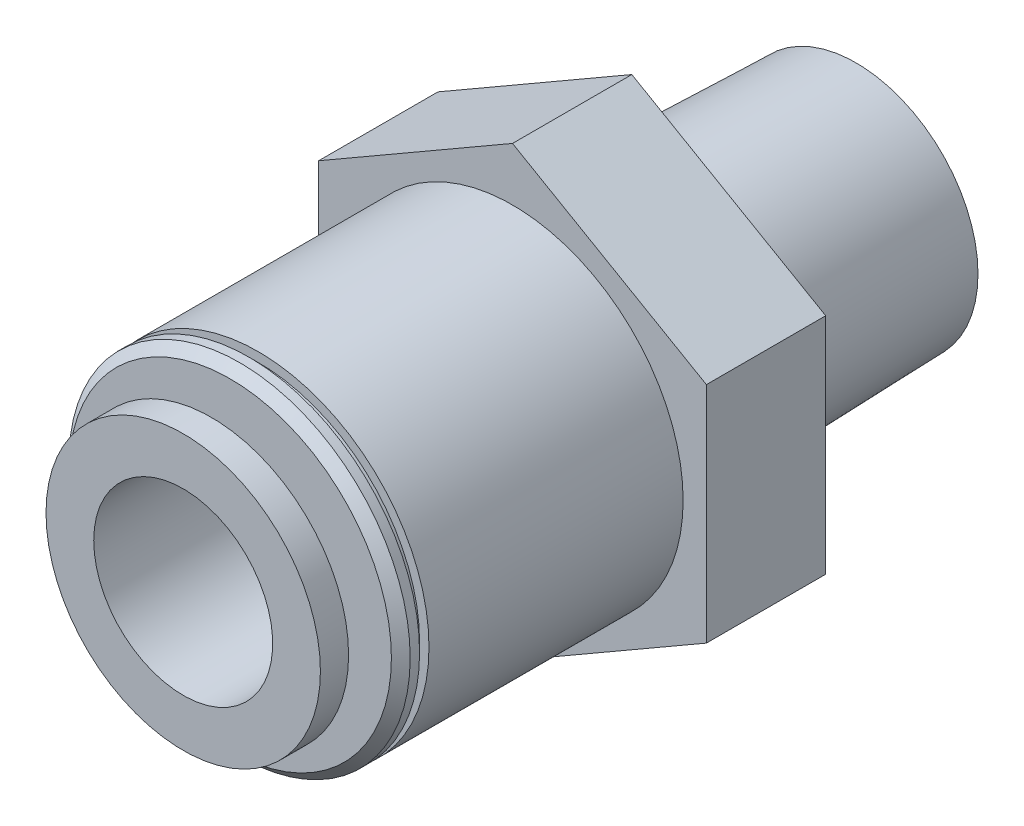
ISO-10303-21;
HEADER;
FILE_DESCRIPTION(('STEP AP214'),'2;1');
FILE_NAME('part.step','',(''),(''),'','','');
FILE_SCHEMA(('AUTOMOTIVE_DESIGN { 1 0 10303 214 1 1 1 1 }'));
ENDSEC;
DATA;
#1=APPLICATION_CONTEXT('core data for automotive mechanical design processes');
#2=APPLICATION_PROTOCOL_DEFINITION('international standard','automotive_design',2000,#1);
#3=PRODUCT_CONTEXT('',#1,'mechanical');
#4=PRODUCT('Part','Part','',(#3));
#5=PRODUCT_RELATED_PRODUCT_CATEGORY('part','',(#4));
#6=PRODUCT_DEFINITION_FORMATION('','',#4);
#7=PRODUCT_DEFINITION_CONTEXT('part definition',#1,'design');
#8=PRODUCT_DEFINITION('design','',#6,#7);
#9=PRODUCT_DEFINITION_SHAPE('','',#8);
#10=(LENGTH_UNIT() NAMED_UNIT(*) SI_UNIT(.MILLI.,.METRE.));
#11=(NAMED_UNIT(*) PLANE_ANGLE_UNIT() SI_UNIT($,.RADIAN.));
#12=(NAMED_UNIT(*) SI_UNIT($,.STERADIAN.) SOLID_ANGLE_UNIT());
#13=UNCERTAINTY_MEASURE_WITH_UNIT(LENGTH_MEASURE(1.E-05),#10,'distance_accuracy_value','');
#14=(GEOMETRIC_REPRESENTATION_CONTEXT(3) GLOBAL_UNCERTAINTY_ASSIGNED_CONTEXT((#13)) GLOBAL_UNIT_ASSIGNED_CONTEXT((#10,
#11,#12)) REPRESENTATION_CONTEXT('',''));
#15=CARTESIAN_POINT('',(0.,0.,0.));
#16=DIRECTION('',(0.,0.,1.));
#17=DIRECTION('',(1.,0.,0.));
#18=AXIS2_PLACEMENT_3D('',#15,#16,#17);
#19=CARTESIAN_POINT('',(0.,11.9150661804009,0.));
#20=DIRECTION('',(0.,0.,-1.));
#21=DIRECTION('',(-1.,0.,0.));
#22=AXIS2_PLACEMENT_3D('',#19,#20,#21);
#23=PLANE('',#22);
#24=DIRECTION('',(0.866025403784439,0.5,0.));
#25=VECTOR('',#24,1.);
#26=CARTESIAN_POINT('',(-10.31875,5.95753309020045,0.));
#27=LINE('',#26,#25);
#28=CARTESIAN_POINT('',(-10.31875,5.95753309020045,0.));
#29=VERTEX_POINT('',#28);
#30=CARTESIAN_POINT('',(0.,11.9150661804009,0.));
#31=VERTEX_POINT('',#30);
#32=EDGE_CURVE('E131',#29,#31,#27,.T.);
#33=ORIENTED_EDGE('',*,*,#32,.T.);
#34=DIRECTION('',(0.866025403784439,-0.5,0.));
#35=VECTOR('',#34,1.);
#36=CARTESIAN_POINT('',(0.,11.9150661804009,0.));
#37=LINE('',#36,#35);
#38=CARTESIAN_POINT('',(10.31875,5.95753309020045,0.));
#39=VERTEX_POINT('',#38);
#40=EDGE_CURVE('E89',#31,#39,#37,.T.);
#41=ORIENTED_EDGE('',*,*,#40,.T.);
#42=DIRECTION('',(0.,-1.,0.));
#43=VECTOR('',#42,1.);
#44=CARTESIAN_POINT('',(10.31875,5.95753309020045,0.));
#45=LINE('',#44,#43);
#46=CARTESIAN_POINT('',(10.31875,-5.95753309020045,0.));
#47=VERTEX_POINT('',#46);
#48=EDGE_CURVE('E102',#39,#47,#45,.T.);
#49=ORIENTED_EDGE('',*,*,#48,.T.);
#50=DIRECTION('',(-0.866025403784439,-0.5,0.));
#51=VECTOR('',#50,1.);
#52=CARTESIAN_POINT('',(10.31875,-5.95753309020045,0.));
#53=LINE('',#52,#51);
#54=CARTESIAN_POINT('',(0.,-11.9150661804009,0.));
#55=VERTEX_POINT('',#54);
#56=EDGE_CURVE('E96',#47,#55,#53,.T.);
#57=ORIENTED_EDGE('',*,*,#56,.T.);
#58=DIRECTION('',(-0.866025403784439,0.5,0.));
#59=VECTOR('',#58,1.);
#60=CARTESIAN_POINT('',(0.,-11.9150661804009,0.));
#61=LINE('',#60,#59);
#62=CARTESIAN_POINT('',(-10.31875,-5.95753309020045,0.));
#63=VERTEX_POINT('',#62);
#64=EDGE_CURVE('E100',#55,#63,#61,.T.);
#65=ORIENTED_EDGE('',*,*,#64,.T.);
#66=DIRECTION('',(0.,1.,0.));
#67=VECTOR('',#66,1.);
#68=CARTESIAN_POINT('',(-10.31875,-5.95753309020045,0.));
#69=LINE('',#68,#67);
#70=EDGE_CURVE('E51',#63,#29,#69,.T.);
#71=ORIENTED_EDGE('',*,*,#70,.T.);
#72=EDGE_LOOP('',(#33,#41,#49,#57,#65,#71));
#73=FACE_BOUND('',#72,.T.);
#74=CARTESIAN_POINT('',(0.,0.,0.));
#75=DIRECTION('',(0.,0.,-1.));
#76=DIRECTION('',(-1.,0.,0.));
#77=AXIS2_PLACEMENT_3D('',#74,#75,#76);
#78=CIRCLE('',#77,6.858);
#79=CARTESIAN_POINT('',(-6.858,0.,0.));
#80=VERTEX_POINT('',#79);
#81=EDGE_CURVE('E259',#80,#80,#78,.T.);
#82=ORIENTED_EDGE('',*,*,#81,.F.);
#83=EDGE_LOOP('',(#82));
#84=FACE_BOUND('',#83,.T.);
#85=ADVANCED_FACE('F34',(#73,#84),#23,.T.);
#86=CARTESIAN_POINT('',(0.,7.3025,23.876));
#87=DIRECTION('',(0.,0.,-1.));
#88=DIRECTION('',(-1.,0.,0.));
#89=AXIS2_PLACEMENT_3D('',#86,#87,#88);
#90=PLANE('',#89);
#91=CARTESIAN_POINT('',(0.,0.,23.876));
#92=DIRECTION('',(0.,0.,-1.));
#93=DIRECTION('',(-1.,0.,0.));
#94=AXIS2_PLACEMENT_3D('',#91,#92,#93);
#95=CIRCLE('',#94,4.7625);
#96=CARTESIAN_POINT('',(-4.7625,0.,23.876));
#97=VERTEX_POINT('',#96);
#98=EDGE_CURVE('E256',#97,#97,#95,.T.);
#99=ORIENTED_EDGE('',*,*,#98,.T.);
#100=EDGE_LOOP('',(#99));
#101=FACE_BOUND('',#100,.T.);
#102=CARTESIAN_POINT('',(0.,0.,23.876));
#103=DIRECTION('',(0.,0.,1.));
#104=DIRECTION('',(1.,0.,0.));
#105=AXIS2_PLACEMENT_3D('',#102,#103,#104);
#106=CIRCLE('',#105,7.3025);
#107=CARTESIAN_POINT('',(7.3025,0.,23.876));
#108=VERTEX_POINT('',#107);
#109=EDGE_CURVE('E143',#108,#108,#106,.T.);
#110=ORIENTED_EDGE('',*,*,#109,.T.);
#111=EDGE_LOOP('',(#110));
#112=FACE_BOUND('',#111,.T.);
#113=ADVANCED_FACE('F36',(#101,#112),#90,.F.);
#114=CARTESIAN_POINT('',(0.,0.,23.876));
#115=DIRECTION('',(0.,0.,1.));
#116=DIRECTION('',(1.,0.,0.));
#117=AXIS2_PLACEMENT_3D('',#114,#115,#116);
#118=CYLINDRICAL_SURFACE('',#117,9.0805);
#119=CARTESIAN_POINT('',(0.,0.,19.876));
#120=DIRECTION('',(0.,0.,1.));
#121=DIRECTION('',(1.,0.,0.));
#122=AXIS2_PLACEMENT_3D('',#119,#120,#121);
#123=CIRCLE('',#122,9.0805);
#124=CARTESIAN_POINT('',(9.0805,0.,19.876));
#125=VERTEX_POINT('',#124);
#126=EDGE_CURVE('E11',#125,#125,#123,.T.);
#127=ORIENTED_EDGE('',*,*,#126,.F.);
#128=EDGE_LOOP('',(#127));
#129=FACE_BOUND('',#128,.T.);
#130=CARTESIAN_POINT('',(0.,0.,6.35));
#131=DIRECTION('',(0.,0.,-1.));
#132=DIRECTION('',(-1.,0.,0.));
#133=AXIS2_PLACEMENT_3D('',#130,#131,#132);
#134=CIRCLE('',#133,9.0805);
#135=CARTESIAN_POINT('',(-9.0805,0.,6.35));
#136=VERTEX_POINT('',#135);
#137=EDGE_CURVE('E140',#136,#136,#134,.T.);
#138=ORIENTED_EDGE('',*,*,#137,.F.);
#139=EDGE_LOOP('',(#138));
#140=FACE_BOUND('',#139,.T.);
#141=ADVANCED_FACE('F174',(#129,#140),#118,.T.);
#142=CARTESIAN_POINT('',(0.,8.5805,19.876));
#143=DIRECTION('',(0.,0.,-1.));
#144=DIRECTION('',(-1.,0.,0.));
#145=AXIS2_PLACEMENT_3D('',#142,#143,#144);
#146=PLANE('',#145);
#147=CARTESIAN_POINT('',(0.,0.,19.876));
#148=DIRECTION('',(0.,0.,1.));
#149=DIRECTION('',(1.,0.,0.));
#150=AXIS2_PLACEMENT_3D('',#147,#148,#149);
#151=CIRCLE('',#150,8.5805);
#152=CARTESIAN_POINT('',(8.5805,0.,19.876));
#153=VERTEX_POINT('',#152);
#154=EDGE_CURVE('E43',#153,#153,#151,.T.);
#155=ORIENTED_EDGE('',*,*,#154,.F.);
#156=EDGE_LOOP('',(#155));
#157=FACE_BOUND('',#156,.T.);
#158=ORIENTED_EDGE('',*,*,#126,.T.);
#159=EDGE_LOOP('',(#158));
#160=FACE_BOUND('',#159,.T.);
#161=ADVANCED_FACE('F171',(#157,#160),#146,.F.);
#162=CARTESIAN_POINT('',(0.,0.,23.876));
#163=DIRECTION('',(0.,0.,1.));
#164=DIRECTION('',(1.,0.,0.));
#165=AXIS2_PLACEMENT_3D('',#162,#163,#164);
#166=CYLINDRICAL_SURFACE('',#165,8.5805);
#167=CARTESIAN_POINT('',(0.,0.,20.376));
#168=DIRECTION('',(0.,0.,1.));
#169=DIRECTION('',(1.,0.,0.));
#170=AXIS2_PLACEMENT_3D('',#167,#168,#169);
#171=CIRCLE('',#170,8.5805);
#172=CARTESIAN_POINT('',(8.5805,0.,20.376));
#173=VERTEX_POINT('',#172);
#174=EDGE_CURVE('E164',#173,#173,#171,.T.);
#175=ORIENTED_EDGE('',*,*,#174,.F.);
#176=EDGE_LOOP('',(#175));
#177=FACE_BOUND('',#176,.T.);
#178=ORIENTED_EDGE('',*,*,#154,.T.);
#179=EDGE_LOOP('',(#178));
#180=FACE_BOUND('',#179,.T.);
#181=ADVANCED_FACE('F169',(#177,#180),#166,.T.);
#182=CARTESIAN_POINT('',(0.,9.0805,20.376));
#183=DIRECTION('',(0.,0.,1.));
#184=DIRECTION('',(1.,0.,0.));
#185=AXIS2_PLACEMENT_3D('',#182,#183,#184);
#186=PLANE('',#185);
#187=CARTESIAN_POINT('',(0.,0.,20.376));
#188=DIRECTION('',(0.,0.,1.));
#189=DIRECTION('',(1.,0.,0.));
#190=AXIS2_PLACEMENT_3D('',#187,#188,#189);
#191=CIRCLE('',#190,9.0805);
#192=CARTESIAN_POINT('',(9.0805,0.,20.376));
#193=VERTEX_POINT('',#192);
#194=EDGE_CURVE('E161',#193,#193,#191,.T.);
#195=ORIENTED_EDGE('',*,*,#194,.F.);
#196=EDGE_LOOP('',(#195));
#197=FACE_BOUND('',#196,.T.);
#198=ORIENTED_EDGE('',*,*,#174,.T.);
#199=EDGE_LOOP('',(#198));
#200=FACE_BOUND('',#199,.T.);
#201=ADVANCED_FACE('F300',(#197,#200),#186,.F.);
#202=CARTESIAN_POINT('',(0.,0.,23.876));
#203=DIRECTION('',(0.,0.,1.));
#204=DIRECTION('',(1.,0.,0.));
#205=AXIS2_PLACEMENT_3D('',#202,#203,#204);
#206=CYLINDRICAL_SURFACE('',#205,9.0805);
#207=CARTESIAN_POINT('',(0.,0.,20.876));
#208=DIRECTION('',(0.,0.,1.));
#209=DIRECTION('',(1.,0.,0.));
#210=AXIS2_PLACEMENT_3D('',#207,#208,#209);
#211=CIRCLE('',#210,9.0805);
#212=CARTESIAN_POINT('',(9.0805,0.,20.876));
#213=VERTEX_POINT('',#212);
#214=EDGE_CURVE('E158',#213,#213,#211,.T.);
#215=ORIENTED_EDGE('',*,*,#214,.F.);
#216=EDGE_LOOP('',(#215));
#217=FACE_BOUND('',#216,.T.);
#218=ORIENTED_EDGE('',*,*,#194,.T.);
#219=EDGE_LOOP('',(#218));
#220=FACE_BOUND('',#219,.T.);
#221=ADVANCED_FACE('F296',(#217,#220),#206,.T.);
#222=CARTESIAN_POINT('',(0.,0.,20.876));
#223=DIRECTION('',(0.,0.,-1.));
#224=DIRECTION('',(-1.,0.,0.));
#225=AXIS2_PLACEMENT_3D('',#222,#223,#224);
#226=CONICAL_SURFACE('',#225,9.0805,0.785398163397452);
#227=CARTESIAN_POINT('',(0.,0.,21.376));
#228=DIRECTION('',(0.,0.,1.));
#229=DIRECTION('',(1.,0.,0.));
#230=AXIS2_PLACEMENT_3D('',#227,#228,#229);
#231=CIRCLE('',#230,8.5805);
#232=CARTESIAN_POINT('',(8.5805,0.,21.376));
#233=VERTEX_POINT('',#232);
#234=EDGE_CURVE('E155',#233,#233,#231,.T.);
#235=ORIENTED_EDGE('',*,*,#234,.F.);
#236=EDGE_LOOP('',(#235));
#237=FACE_BOUND('',#236,.T.);
#238=ORIENTED_EDGE('',*,*,#214,.T.);
#239=EDGE_LOOP('',(#238));
#240=FACE_BOUND('',#239,.T.);
#241=ADVANCED_FACE('F292',(#237,#240),#226,.T.);
#242=CARTESIAN_POINT('',(0.,8.5805,21.376));
#243=DIRECTION('',(0.,0.,-1.));
#244=DIRECTION('',(-1.,0.,0.));
#245=AXIS2_PLACEMENT_3D('',#242,#243,#244);
#246=PLANE('',#245);
#247=CARTESIAN_POINT('',(0.,0.,21.376));
#248=DIRECTION('',(0.,0.,1.));
#249=DIRECTION('',(1.,0.,0.));
#250=AXIS2_PLACEMENT_3D('',#247,#248,#249);
#251=CIRCLE('',#250,5.3975);
#252=CARTESIAN_POINT('',(5.3975,0.,21.376));
#253=VERTEX_POINT('',#252);
#254=EDGE_CURVE('E152',#253,#253,#251,.T.);
#255=ORIENTED_EDGE('',*,*,#254,.F.);
#256=EDGE_LOOP('',(#255));
#257=FACE_BOUND('',#256,.T.);
#258=ORIENTED_EDGE('',*,*,#234,.T.);
#259=EDGE_LOOP('',(#258));
#260=FACE_BOUND('',#259,.T.);
#261=ADVANCED_FACE('F288',(#257,#260),#246,.F.);
#262=CARTESIAN_POINT('',(0.,0.,23.876));
#263=DIRECTION('',(0.,0.,1.));
#264=DIRECTION('',(1.,0.,0.));
#265=AXIS2_PLACEMENT_3D('',#262,#263,#264);
#266=CYLINDRICAL_SURFACE('',#265,5.3975);
#267=CARTESIAN_POINT('',(0.,0.,22.376));
#268=DIRECTION('',(0.,0.,1.));
#269=DIRECTION('',(1.,0.,0.));
#270=AXIS2_PLACEMENT_3D('',#267,#268,#269);
#271=CIRCLE('',#270,5.3975);
#272=CARTESIAN_POINT('',(5.3975,0.,22.376));
#273=VERTEX_POINT('',#272);
#274=EDGE_CURVE('E149',#273,#273,#271,.T.);
#275=ORIENTED_EDGE('',*,*,#274,.F.);
#276=EDGE_LOOP('',(#275));
#277=FACE_BOUND('',#276,.T.);
#278=ORIENTED_EDGE('',*,*,#254,.T.);
#279=EDGE_LOOP('',(#278));
#280=FACE_BOUND('',#279,.T.);
#281=ADVANCED_FACE('F284',(#277,#280),#266,.T.);
#282=CARTESIAN_POINT('',(0.,5.3975,22.376));
#283=DIRECTION('',(0.,0.,1.));
#284=DIRECTION('',(1.,0.,0.));
#285=AXIS2_PLACEMENT_3D('',#282,#283,#284);
#286=PLANE('',#285);
#287=CARTESIAN_POINT('',(0.,0.,22.376));
#288=DIRECTION('',(0.,0.,1.));
#289=DIRECTION('',(1.,0.,0.));
#290=AXIS2_PLACEMENT_3D('',#287,#288,#289);
#291=CIRCLE('',#290,7.3025);
#292=CARTESIAN_POINT('',(7.3025,0.,22.376));
#293=VERTEX_POINT('',#292);
#294=EDGE_CURVE('E146',#293,#293,#291,.T.);
#295=ORIENTED_EDGE('',*,*,#294,.F.);
#296=EDGE_LOOP('',(#295));
#297=FACE_BOUND('',#296,.T.);
#298=ORIENTED_EDGE('',*,*,#274,.T.);
#299=EDGE_LOOP('',(#298));
#300=FACE_BOUND('',#299,.T.);
#301=ADVANCED_FACE('F195',(#297,#300),#286,.F.);
#302=CARTESIAN_POINT('',(0.,0.,23.876));
#303=DIRECTION('',(0.,0.,1.));
#304=DIRECTION('',(1.,0.,0.));
#305=AXIS2_PLACEMENT_3D('',#302,#303,#304);
#306=CYLINDRICAL_SURFACE('',#305,7.3025);
#307=ORIENTED_EDGE('',*,*,#109,.F.);
#308=EDGE_LOOP('',(#307));
#309=FACE_BOUND('',#308,.T.);
#310=ORIENTED_EDGE('',*,*,#294,.T.);
#311=EDGE_LOOP('',(#310));
#312=FACE_BOUND('',#311,.T.);
#313=ADVANCED_FACE('F185',(#309,#312),#306,.T.);
#314=CARTESIAN_POINT('',(0.,11.9150661804009,6.35));
#315=DIRECTION('',(0.,0.,-1.));
#316=DIRECTION('',(-1.,0.,0.));
#317=AXIS2_PLACEMENT_3D('',#314,#315,#316);
#318=PLANE('',#317);
#319=DIRECTION('',(0.866025403784439,0.5,0.));
#320=VECTOR('',#319,1.);
#321=CARTESIAN_POINT('',(-10.31875,5.95753309020045,6.35));
#322=LINE('',#321,#320);
#323=CARTESIAN_POINT('',(-10.31875,5.95753309020045,6.35));
#324=VERTEX_POINT('',#323);
#325=CARTESIAN_POINT('',(0.,11.9150661804009,6.35));
#326=VERTEX_POINT('',#325);
#327=EDGE_CURVE('E120',#324,#326,#322,.T.);
#328=ORIENTED_EDGE('',*,*,#327,.F.);
#329=DIRECTION('',(0.,1.,0.));
#330=VECTOR('',#329,1.);
#331=CARTESIAN_POINT('',(-10.31875,-5.95753309020045,6.35));
#332=LINE('',#331,#330);
#333=CARTESIAN_POINT('',(-10.31875,-5.95753309020045,6.35));
#334=VERTEX_POINT('',#333);
#335=EDGE_CURVE('E80',#334,#324,#332,.T.);
#336=ORIENTED_EDGE('',*,*,#335,.F.);
#337=DIRECTION('',(-0.866025403784439,0.5,0.));
#338=VECTOR('',#337,1.);
#339=CARTESIAN_POINT('',(0.,-11.9150661804009,6.35));
#340=LINE('',#339,#338);
#341=CARTESIAN_POINT('',(0.,-11.9150661804009,6.35));
#342=VERTEX_POINT('',#341);
#343=EDGE_CURVE('E74',#342,#334,#340,.T.);
#344=ORIENTED_EDGE('',*,*,#343,.F.);
#345=DIRECTION('',(-0.866025403784439,-0.5,0.));
#346=VECTOR('',#345,1.);
#347=CARTESIAN_POINT('',(10.31875,-5.95753309020045,6.35));
#348=LINE('',#347,#346);
#349=CARTESIAN_POINT('',(10.31875,-5.95753309020045,6.35));
#350=VERTEX_POINT('',#349);
#351=EDGE_CURVE('E110',#350,#342,#348,.T.);
#352=ORIENTED_EDGE('',*,*,#351,.F.);
#353=DIRECTION('',(0.,-1.,0.));
#354=VECTOR('',#353,1.);
#355=CARTESIAN_POINT('',(10.31875,5.95753309020045,6.35));
#356=LINE('',#355,#354);
#357=CARTESIAN_POINT('',(10.31875,5.95753309020045,6.35));
#358=VERTEX_POINT('',#357);
#359=EDGE_CURVE('E126',#358,#350,#356,.T.);
#360=ORIENTED_EDGE('',*,*,#359,.F.);
#361=DIRECTION('',(0.866025403784439,-0.5,0.));
#362=VECTOR('',#361,1.);
#363=CARTESIAN_POINT('',(0.,11.9150661804009,6.35));
#364=LINE('',#363,#362);
#365=EDGE_CURVE('E123',#326,#358,#364,.T.);
#366=ORIENTED_EDGE('',*,*,#365,.F.);
#367=EDGE_LOOP('',(#328,#336,#344,#352,#360,#366));
#368=FACE_BOUND('',#367,.T.);
#369=ORIENTED_EDGE('',*,*,#137,.T.);
#370=EDGE_LOOP('',(#369));
#371=FACE_BOUND('',#370,.T.);
#372=ADVANCED_FACE('F182',(#368,#371),#318,.F.);
#373=CARTESIAN_POINT('',(-10.31875,5.95753309020045,0.));
#374=DIRECTION('',(0.5,-0.866025403784439,0.));
#375=DIRECTION('',(0.866025403784439,0.5,0.));
#376=AXIS2_PLACEMENT_3D('',#373,#374,#375);
#377=PLANE('',#376);
#378=ORIENTED_EDGE('',*,*,#327,.T.);
#379=DIRECTION('',(0.,0.,1.));
#380=VECTOR('',#379,1.);
#381=CARTESIAN_POINT('',(0.,11.9150661804009,0.));
#382=LINE('',#381,#380);
#383=EDGE_CURVE('E138',#31,#326,#382,.T.);
#384=ORIENTED_EDGE('',*,*,#383,.F.);
#385=ORIENTED_EDGE('',*,*,#32,.F.);
#386=DIRECTION('',(0.,0.,1.));
#387=VECTOR('',#386,1.);
#388=CARTESIAN_POINT('',(-10.31875,5.95753309020045,0.));
#389=LINE('',#388,#387);
#390=EDGE_CURVE('E116',#29,#324,#389,.T.);
#391=ORIENTED_EDGE('',*,*,#390,.T.);
#392=EDGE_LOOP('',(#378,#384,#385,#391));
#393=FACE_BOUND('',#392,.T.);
#394=ADVANCED_FACE('F184',(#393),#377,.F.);
#395=CARTESIAN_POINT('',(0.,11.9150661804009,0.));
#396=DIRECTION('',(-0.5,-0.866025403784439,0.));
#397=DIRECTION('',(0.866025403784439,-0.5,0.));
#398=AXIS2_PLACEMENT_3D('',#395,#396,#397);
#399=PLANE('',#398);
#400=ORIENTED_EDGE('',*,*,#365,.T.);
#401=DIRECTION('',(0.,0.,1.));
#402=VECTOR('',#401,1.);
#403=CARTESIAN_POINT('',(10.31875,5.95753309020045,0.));
#404=LINE('',#403,#402);
#405=EDGE_CURVE('E135',#39,#358,#404,.T.);
#406=ORIENTED_EDGE('',*,*,#405,.F.);
#407=ORIENTED_EDGE('',*,*,#40,.F.);
#408=ORIENTED_EDGE('',*,*,#383,.T.);
#409=EDGE_LOOP('',(#400,#406,#407,#408));
#410=FACE_BOUND('',#409,.T.);
#411=ADVANCED_FACE('F192',(#410),#399,.F.);
#412=CARTESIAN_POINT('',(10.31875,5.95753309020045,0.));
#413=DIRECTION('',(-1.,0.,0.));
#414=DIRECTION('',(0.,0.,1.));
#415=AXIS2_PLACEMENT_3D('',#412,#413,#414);
#416=PLANE('',#415);
#417=ORIENTED_EDGE('',*,*,#359,.T.);
#418=DIRECTION('',(0.,0.,1.));
#419=VECTOR('',#418,1.);
#420=CARTESIAN_POINT('',(10.31875,-5.95753309020045,0.));
#421=LINE('',#420,#419);
#422=EDGE_CURVE('E111',#47,#350,#421,.T.);
#423=ORIENTED_EDGE('',*,*,#422,.F.);
#424=ORIENTED_EDGE('',*,*,#48,.F.);
#425=ORIENTED_EDGE('',*,*,#405,.T.);
#426=EDGE_LOOP('',(#417,#423,#424,#425));
#427=FACE_BOUND('',#426,.T.);
#428=ADVANCED_FACE('F269',(#427),#416,.F.);
#429=CARTESIAN_POINT('',(10.31875,-5.95753309020045,0.));
#430=DIRECTION('',(-0.5,0.866025403784439,0.));
#431=DIRECTION('',(-0.866025403784439,-0.5,0.));
#432=AXIS2_PLACEMENT_3D('',#429,#430,#431);
#433=PLANE('',#432);
#434=ORIENTED_EDGE('',*,*,#351,.T.);
#435=DIRECTION('',(0.,0.,1.));
#436=VECTOR('',#435,1.);
#437=CARTESIAN_POINT('',(0.,-11.9150661804009,0.));
#438=LINE('',#437,#436);
#439=EDGE_CURVE('E107',#55,#342,#438,.T.);
#440=ORIENTED_EDGE('',*,*,#439,.F.);
#441=ORIENTED_EDGE('',*,*,#56,.F.);
#442=ORIENTED_EDGE('',*,*,#422,.T.);
#443=EDGE_LOOP('',(#434,#440,#441,#442));
#444=FACE_BOUND('',#443,.T.);
#445=ADVANCED_FACE('F108',(#444),#433,.F.);
#446=CARTESIAN_POINT('',(0.,-11.9150661804009,0.));
#447=DIRECTION('',(0.5,0.866025403784439,0.));
#448=DIRECTION('',(-0.866025403784439,0.5,0.));
#449=AXIS2_PLACEMENT_3D('',#446,#447,#448);
#450=PLANE('',#449);
#451=ORIENTED_EDGE('',*,*,#343,.T.);
#452=DIRECTION('',(0.,0.,1.));
#453=VECTOR('',#452,1.);
#454=CARTESIAN_POINT('',(-10.31875,-5.95753309020045,0.));
#455=LINE('',#454,#453);
#456=EDGE_CURVE('E112',#63,#334,#455,.T.);
#457=ORIENTED_EDGE('',*,*,#456,.F.);
#458=ORIENTED_EDGE('',*,*,#64,.F.);
#459=ORIENTED_EDGE('',*,*,#439,.T.);
#460=EDGE_LOOP('',(#451,#457,#458,#459));
#461=FACE_BOUND('',#460,.T.);
#462=ADVANCED_FACE('F114',(#461),#450,.F.);
#463=CARTESIAN_POINT('',(-10.31875,-5.95753309020045,0.));
#464=DIRECTION('',(1.,0.,0.));
#465=DIRECTION('',(0.,1.,0.));
#466=AXIS2_PLACEMENT_3D('',#463,#464,#465);
#467=PLANE('',#466);
#468=ORIENTED_EDGE('',*,*,#335,.T.);
#469=ORIENTED_EDGE('',*,*,#390,.F.);
#470=ORIENTED_EDGE('',*,*,#70,.F.);
#471=ORIENTED_EDGE('',*,*,#456,.T.);
#472=EDGE_LOOP('',(#468,#469,#470,#471));
#473=FACE_BOUND('',#472,.T.);
#474=ADVANCED_FACE('F211',(#473),#467,.F.);
#475=CARTESIAN_POINT('',(0.,0.,0.));
#476=DIRECTION('',(0.,0.,1.));
#477=DIRECTION('',(-1.,0.,0.));
#478=AXIS2_PLACEMENT_3D('',#475,#476,#477);
#479=CONICAL_SURFACE('',#478,6.858,0.0311250383272323);
#480=CARTESIAN_POINT('',(0.,0.,-11.938));
#481=DIRECTION('',(0.,0.,-1.));
#482=DIRECTION('',(-1.,0.,0.));
#483=AXIS2_PLACEMENT_3D('',#480,#481,#482);
#484=CIRCLE('',#483,6.48630925732973);
#485=CARTESIAN_POINT('',(-6.48630925732973,0.,-11.938));
#486=VERTEX_POINT('',#485);
#487=EDGE_CURVE('E124',#486,#486,#484,.T.);
#488=ORIENTED_EDGE('',*,*,#487,.F.);
#489=EDGE_LOOP('',(#488));
#490=FACE_BOUND('',#489,.T.);
#491=ORIENTED_EDGE('',*,*,#81,.T.);
#492=EDGE_LOOP('',(#491));
#493=FACE_BOUND('',#492,.T.);
#494=ADVANCED_FACE('F207',(#490,#493),#479,.T.);
#495=CARTESIAN_POINT('',(0.,0.,-11.938));
#496=DIRECTION('',(0.,0.,-1.));
#497=DIRECTION('',(-1.,0.,0.));
#498=AXIS2_PLACEMENT_3D('',#495,#496,#497);
#499=PLANE('',#498);
#500=CARTESIAN_POINT('',(0.,0.,-11.938));
#501=DIRECTION('',(0.,0.,-1.));
#502=DIRECTION('',(-1.,0.,0.));
#503=AXIS2_PLACEMENT_3D('',#500,#501,#502);
#504=CIRCLE('',#503,4.6228);
#505=CARTESIAN_POINT('',(-4.6228,0.,-11.938));
#506=VERTEX_POINT('',#505);
#507=EDGE_CURVE('E243',#506,#506,#504,.T.);
#508=ORIENTED_EDGE('',*,*,#507,.F.);
#509=EDGE_LOOP('',(#508));
#510=FACE_BOUND('',#509,.T.);
#511=ORIENTED_EDGE('',*,*,#487,.T.);
#512=EDGE_LOOP('',(#511));
#513=FACE_BOUND('',#512,.T.);
#514=ADVANCED_FACE('F210',(#510,#513),#499,.T.);
#515=CARTESIAN_POINT('',(0.,0.,-11.938));
#516=DIRECTION('',(0.,0.,-1.));
#517=DIRECTION('',(-1.,0.,0.));
#518=AXIS2_PLACEMENT_3D('',#515,#516,#517);
#519=CYLINDRICAL_SURFACE('',#518,4.7625);
#520=ORIENTED_EDGE('',*,*,#98,.F.);
#521=EDGE_LOOP('',(#520));
#522=FACE_BOUND('',#521,.T.);
#523=CARTESIAN_POINT('',(0.,0.,1.905));
#524=DIRECTION('',(0.,0.,-1.));
#525=DIRECTION('',(-1.,0.,0.));
#526=AXIS2_PLACEMENT_3D('',#523,#524,#525);
#527=CIRCLE('',#526,4.7625);
#528=CARTESIAN_POINT('',(-4.7625,0.,1.905));
#529=VERTEX_POINT('',#528);
#530=EDGE_CURVE('E253',#529,#529,#527,.T.);
#531=ORIENTED_EDGE('',*,*,#530,.T.);
#532=EDGE_LOOP('',(#531));
#533=FACE_BOUND('',#532,.T.);
#534=ADVANCED_FACE('F215',(#522,#533),#519,.F.);
#535=CARTESIAN_POINT('',(0.,4.7625,1.905));
#536=DIRECTION('',(0.,0.,-1.));
#537=DIRECTION('',(-1.,0.,0.));
#538=AXIS2_PLACEMENT_3D('',#535,#536,#537);
#539=PLANE('',#538);
#540=ORIENTED_EDGE('',*,*,#530,.F.);
#541=EDGE_LOOP('',(#540));
#542=FACE_BOUND('',#541,.T.);
#543=CARTESIAN_POINT('',(0.,0.,1.905));
#544=DIRECTION('',(0.,0.,-1.));
#545=DIRECTION('',(-1.,0.,0.));
#546=AXIS2_PLACEMENT_3D('',#543,#544,#545);
#547=CIRCLE('',#546,3.81);
#548=CARTESIAN_POINT('',(-3.81,0.,1.905));
#549=VERTEX_POINT('',#548);
#550=EDGE_CURVE('E250',#549,#549,#547,.T.);
#551=ORIENTED_EDGE('',*,*,#550,.T.);
#552=EDGE_LOOP('',(#551));
#553=FACE_BOUND('',#552,.T.);
#554=ADVANCED_FACE('F219',(#542,#553),#539,.F.);
#555=CARTESIAN_POINT('',(0.,0.,-11.938));
#556=DIRECTION('',(0.,0.,-1.));
#557=DIRECTION('',(-1.,0.,0.));
#558=AXIS2_PLACEMENT_3D('',#555,#556,#557);
#559=CYLINDRICAL_SURFACE('',#558,3.81);
#560=ORIENTED_EDGE('',*,*,#550,.F.);
#561=EDGE_LOOP('',(#560));
#562=FACE_BOUND('',#561,.T.);
#563=CARTESIAN_POINT('',(0.,0.,0.956760374743387));
#564=DIRECTION('',(0.,0.,-1.));
#565=DIRECTION('',(-1.,0.,0.));
#566=AXIS2_PLACEMENT_3D('',#563,#564,#565);
#567=CIRCLE('',#566,3.81);
#568=CARTESIAN_POINT('',(-3.81,0.,0.956760374743387));
#569=VERTEX_POINT('',#568);
#570=EDGE_CURVE('E245',#569,#569,#567,.T.);
#571=ORIENTED_EDGE('',*,*,#570,.T.);
#572=EDGE_LOOP('',(#571));
#573=FACE_BOUND('',#572,.T.);
#574=ADVANCED_FACE('F223',(#562,#573),#559,.F.);
#575=CARTESIAN_POINT('',(0.,0.,0.468380863597788));
#576=DIRECTION('',(0.,0.,-1.));
#577=DIRECTION('',(-1.,0.,0.));
#578=AXIS2_PLACEMENT_3D('',#575,#576,#577);
#579=CONICAL_SURFACE('',#578,4.6228,1.02974425867666);
#580=ORIENTED_EDGE('',*,*,#570,.F.);
#581=EDGE_LOOP('',(#580));
#582=FACE_BOUND('',#581,.T.);
#583=CARTESIAN_POINT('',(0.,0.,0.468380863597788));
#584=DIRECTION('',(0.,0.,-1.));
#585=DIRECTION('',(-1.,0.,0.));
#586=AXIS2_PLACEMENT_3D('',#583,#584,#585);
#587=CIRCLE('',#586,4.6228);
#588=CARTESIAN_POINT('',(-4.6228,0.,0.468380863597788));
#589=VERTEX_POINT('',#588);
#590=EDGE_CURVE('E240',#589,#589,#587,.T.);
#591=ORIENTED_EDGE('',*,*,#590,.T.);
#592=EDGE_LOOP('',(#591));
#593=FACE_BOUND('',#592,.T.);
#594=ADVANCED_FACE('F227',(#582,#593),#579,.F.);
#595=CARTESIAN_POINT('',(0.,0.,-11.938));
#596=DIRECTION('',(0.,0.,-1.));
#597=DIRECTION('',(-1.,0.,0.));
#598=AXIS2_PLACEMENT_3D('',#595,#596,#597);
#599=CYLINDRICAL_SURFACE('',#598,4.6228);
#600=ORIENTED_EDGE('',*,*,#590,.F.);
#601=EDGE_LOOP('',(#600));
#602=FACE_BOUND('',#601,.T.);
#603=ORIENTED_EDGE('',*,*,#507,.T.);
#604=EDGE_LOOP('',(#603));
#605=FACE_BOUND('',#604,.T.);
#606=ADVANCED_FACE('F231',(#602,#605),#599,.F.);
#607=CLOSED_SHELL('',(#85,#113,#141,#161,#181,#201,#221,#241,#261,#281,#301,#313,#372,#394,#411,
#428,#445,#462,#474,#494,#514,#534,#554,#574,#594,#606));
#608=MANIFOLD_SOLID_BREP('B2',#607);
#609=ADVANCED_BREP_SHAPE_REPRESENTATION('',(#18,#608),#14);
#610=SHAPE_DEFINITION_REPRESENTATION(#9,#609);
ENDSEC;
END-ISO-10303-21;
